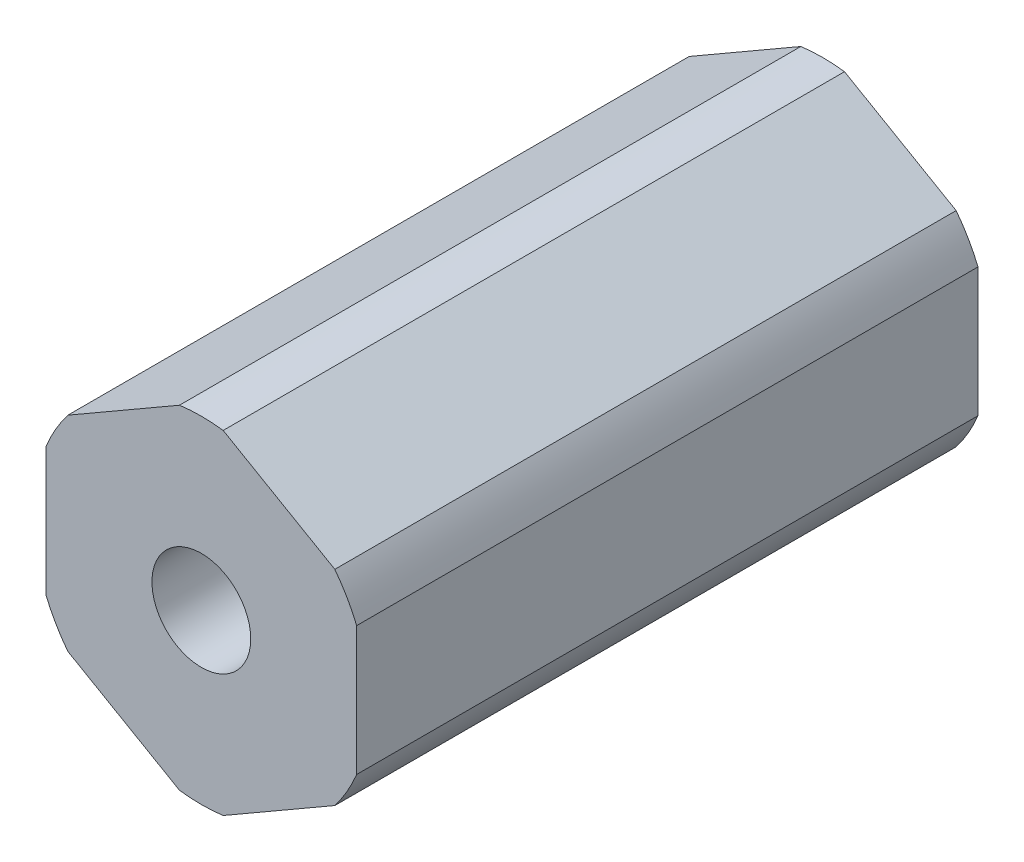
ISO-10303-21;
HEADER;
FILE_DESCRIPTION(('STEP AP214'),'2;1');
FILE_NAME('part.step','',(''),(''),'','','');
FILE_SCHEMA(('AUTOMOTIVE_DESIGN { 1 0 10303 214 1 1 1 1 }'));
ENDSEC;
DATA;
#1=APPLICATION_CONTEXT('core data for automotive mechanical design processes');
#2=APPLICATION_PROTOCOL_DEFINITION('international standard','automotive_design',2000,#1);
#3=PRODUCT_CONTEXT('',#1,'mechanical');
#4=PRODUCT('Part','Part','',(#3));
#5=PRODUCT_RELATED_PRODUCT_CATEGORY('part','',(#4));
#6=PRODUCT_DEFINITION_FORMATION('','',#4);
#7=PRODUCT_DEFINITION_CONTEXT('part definition',#1,'design');
#8=PRODUCT_DEFINITION('design','',#6,#7);
#9=PRODUCT_DEFINITION_SHAPE('','',#8);
#10=(LENGTH_UNIT() NAMED_UNIT(*) SI_UNIT(.MILLI.,.METRE.));
#11=(NAMED_UNIT(*) PLANE_ANGLE_UNIT() SI_UNIT($,.RADIAN.));
#12=(NAMED_UNIT(*) SI_UNIT($,.STERADIAN.) SOLID_ANGLE_UNIT());
#13=UNCERTAINTY_MEASURE_WITH_UNIT(LENGTH_MEASURE(1.E-05),#10,'distance_accuracy_value','');
#14=(GEOMETRIC_REPRESENTATION_CONTEXT(3) GLOBAL_UNCERTAINTY_ASSIGNED_CONTEXT((#13)) GLOBAL_UNIT_ASSIGNED_CONTEXT((#10,
#11,#12)) REPRESENTATION_CONTEXT('',''));
#15=CARTESIAN_POINT('',(0.,0.,0.));
#16=DIRECTION('',(0.,0.,1.));
#17=DIRECTION('',(1.,0.,0.));
#18=AXIS2_PLACEMENT_3D('',#15,#16,#17);
#19=CARTESIAN_POINT('',(6.34999999999999,0.,25.4));
#20=DIRECTION('',(-1.,0.,0.));
#21=DIRECTION('',(0.,-1.,0.));
#22=AXIS2_PLACEMENT_3D('',#19,#20,#21);
#23=PLANE('',#22);
#24=DIRECTION('',(0.,1.,0.));
#25=VECTOR('',#24,1.);
#26=CARTESIAN_POINT('',(6.34999999999999,0.,0.));
#27=LINE('',#26,#25);
#28=CARTESIAN_POINT('',(6.35000000000002,-2.63498093588924,0.));
#29=VERTEX_POINT('',#28);
#30=CARTESIAN_POINT('',(6.34999999999997,2.63498093588937,0.));
#31=VERTEX_POINT('',#30);
#32=EDGE_CURVE('E170',#29,#31,#27,.T.);
#33=ORIENTED_EDGE('',*,*,#32,.T.);
#34=DIRECTION('',(0.,0.,-1.));
#35=VECTOR('',#34,1.);
#36=CARTESIAN_POINT('',(6.34999999999997,2.63498093588937,25.4));
#37=LINE('',#36,#35);
#38=CARTESIAN_POINT('',(6.34999999999997,2.63498093588937,25.4));
#39=VERTEX_POINT('',#38);
#40=EDGE_CURVE('E11',#39,#31,#37,.T.);
#41=ORIENTED_EDGE('',*,*,#40,.F.);
#42=DIRECTION('',(0.,1.,0.));
#43=VECTOR('',#42,1.);
#44=CARTESIAN_POINT('',(6.34999999999999,0.,25.4));
#45=LINE('',#44,#43);
#46=CARTESIAN_POINT('',(6.35000000000002,-2.63498093588924,25.4));
#47=VERTEX_POINT('',#46);
#48=EDGE_CURVE('E229',#47,#39,#45,.T.);
#49=ORIENTED_EDGE('',*,*,#48,.F.);
#50=DIRECTION('',(0.,0.,-1.));
#51=VECTOR('',#50,1.);
#52=CARTESIAN_POINT('',(6.35000000000002,-2.63498093588924,25.4));
#53=LINE('',#52,#51);
#54=EDGE_CURVE('E163',#47,#29,#53,.T.);
#55=ORIENTED_EDGE('',*,*,#54,.T.);
#56=EDGE_LOOP('',(#33,#41,#49,#55));
#57=FACE_BOUND('',#56,.T.);
#58=ADVANCED_FACE('F45',(#57),#23,.F.);
#59=CARTESIAN_POINT('',(0.,0.,25.4));
#60=DIRECTION('',(0.,0.,-1.));
#61=DIRECTION('',(-1.,0.,0.));
#62=AXIS2_PLACEMENT_3D('',#59,#60,#61);
#63=CYLINDRICAL_SURFACE('',#62,6.874999966);
#64=CARTESIAN_POINT('',(0.,0.,0.));
#65=DIRECTION('',(0.,0.,1.));
#66=DIRECTION('',(1.,0.,0.));
#67=AXIS2_PLACEMENT_3D('',#64,#65,#66);
#68=CIRCLE('',#67,6.874999966);
#69=CARTESIAN_POINT('',(5.45696042896777,4.18177084608661,0.));
#70=VERTEX_POINT('',#69);
#71=EDGE_CURVE('E173',#31,#70,#68,.T.);
#72=ORIENTED_EDGE('',*,*,#71,.T.);
#73=DIRECTION('',(0.,0.,-1.));
#74=VECTOR('',#73,1.);
#75=CARTESIAN_POINT('',(5.45696042896777,4.18177084608661,25.4));
#76=LINE('',#75,#74);
#77=CARTESIAN_POINT('',(5.45696042896777,4.18177084608661,25.4));
#78=VERTEX_POINT('',#77);
#79=EDGE_CURVE('E54',#78,#70,#76,.T.);
#80=ORIENTED_EDGE('',*,*,#79,.F.);
#81=CARTESIAN_POINT('',(0.,0.,25.4));
#82=DIRECTION('',(0.,0.,1.));
#83=DIRECTION('',(1.,0.,0.));
#84=AXIS2_PLACEMENT_3D('',#81,#82,#83);
#85=CIRCLE('',#84,6.874999966);
#86=EDGE_CURVE('E117',#39,#78,#85,.T.);
#87=ORIENTED_EDGE('',*,*,#86,.F.);
#88=ORIENTED_EDGE('',*,*,#40,.T.);
#89=EDGE_LOOP('',(#72,#80,#87,#88));
#90=FACE_BOUND('',#89,.T.);
#91=ADVANCED_FACE('F264',(#90),#63,.T.);
#92=CARTESIAN_POINT('',(3.17499999999998,5.49926131403122,25.4));
#93=DIRECTION('',(-0.499999999999995,-0.866025403784441,0.));
#94=DIRECTION('',(0.866025403784442,-0.499999999999995,0.));
#95=AXIS2_PLACEMENT_3D('',#92,#93,#94);
#96=PLANE('',#95);
#97=DIRECTION('',(-0.866025403784442,0.499999999999995,0.));
#98=VECTOR('',#97,1.);
#99=CARTESIAN_POINT('',(3.17499999999998,5.49926131403122,0.));
#100=LINE('',#99,#98);
#101=CARTESIAN_POINT('',(0.893039571032191,6.81675178197583,0.));
#102=VERTEX_POINT('',#101);
#103=EDGE_CURVE('E175',#70,#102,#100,.T.);
#104=ORIENTED_EDGE('',*,*,#103,.T.);
#105=DIRECTION('',(0.,0.,-1.));
#106=VECTOR('',#105,1.);
#107=CARTESIAN_POINT('',(0.893039571032191,6.81675178197583,25.4));
#108=LINE('',#107,#106);
#109=CARTESIAN_POINT('',(0.893039571032191,6.81675178197583,25.4));
#110=VERTEX_POINT('',#109);
#111=EDGE_CURVE('E205',#110,#102,#108,.T.);
#112=ORIENTED_EDGE('',*,*,#111,.F.);
#113=DIRECTION('',(-0.866025403784442,0.499999999999995,0.));
#114=VECTOR('',#113,1.);
#115=CARTESIAN_POINT('',(3.17499999999998,5.49926131403122,25.4));
#116=LINE('',#115,#114);
#117=EDGE_CURVE('E213',#78,#110,#116,.T.);
#118=ORIENTED_EDGE('',*,*,#117,.F.);
#119=ORIENTED_EDGE('',*,*,#79,.T.);
#120=EDGE_LOOP('',(#104,#112,#118,#119));
#121=FACE_BOUND('',#120,.T.);
#122=ADVANCED_FACE('F211',(#121),#96,.F.);
#123=CARTESIAN_POINT('',(-0.893039571032176,6.81675178197583,0.));
#124=VERTEX_POINT('',#123);
#125=EDGE_CURVE('E176',#102,#124,#68,.T.);
#126=ORIENTED_EDGE('',*,*,#125,.T.);
#127=DIRECTION('',(0.,0.,-1.));
#128=VECTOR('',#127,1.);
#129=CARTESIAN_POINT('',(-0.893039571032176,6.81675178197583,25.4));
#130=LINE('',#129,#128);
#131=CARTESIAN_POINT('',(-0.893039571032176,6.81675178197583,25.4));
#132=VERTEX_POINT('',#131);
#133=EDGE_CURVE('E202',#132,#124,#130,.T.);
#134=ORIENTED_EDGE('',*,*,#133,.F.);
#135=EDGE_CURVE('E235',#110,#132,#85,.T.);
#136=ORIENTED_EDGE('',*,*,#135,.F.);
#137=ORIENTED_EDGE('',*,*,#111,.T.);
#138=EDGE_LOOP('',(#126,#134,#136,#137));
#139=FACE_BOUND('',#138,.T.);
#140=ADVANCED_FACE('F246',(#139),#63,.T.);
#141=CARTESIAN_POINT('',(-3.175,5.49926131403118,25.4));
#142=DIRECTION('',(0.500000000000001,-0.866025403784438,0.));
#143=DIRECTION('',(0.866025403784438,0.500000000000001,0.));
#144=AXIS2_PLACEMENT_3D('',#141,#142,#143);
#145=PLANE('',#144);
#146=DIRECTION('',(-0.866025403784438,-0.500000000000001,0.));
#147=VECTOR('',#146,1.);
#148=CARTESIAN_POINT('',(-3.175,5.49926131403118,0.));
#149=LINE('',#148,#147);
#150=CARTESIAN_POINT('',(-5.45696042896783,4.18177084608652,0.));
#151=VERTEX_POINT('',#150);
#152=EDGE_CURVE('E178',#124,#151,#149,.T.);
#153=ORIENTED_EDGE('',*,*,#152,.T.);
#154=DIRECTION('',(0.,0.,-1.));
#155=VECTOR('',#154,1.);
#156=CARTESIAN_POINT('',(-5.45696042896783,4.18177084608652,25.4));
#157=LINE('',#156,#155);
#158=CARTESIAN_POINT('',(-5.45696042896783,4.18177084608652,25.4));
#159=VERTEX_POINT('',#158);
#160=EDGE_CURVE('E199',#159,#151,#157,.T.);
#161=ORIENTED_EDGE('',*,*,#160,.F.);
#162=DIRECTION('',(-0.866025403784438,-0.500000000000001,0.));
#163=VECTOR('',#162,1.);
#164=CARTESIAN_POINT('',(-3.175,5.49926131403118,25.4));
#165=LINE('',#164,#163);
#166=EDGE_CURVE('E237',#132,#159,#165,.T.);
#167=ORIENTED_EDGE('',*,*,#166,.F.);
#168=ORIENTED_EDGE('',*,*,#133,.T.);
#169=EDGE_LOOP('',(#153,#161,#167,#168));
#170=FACE_BOUND('',#169,.T.);
#171=ADVANCED_FACE('F248',(#170),#145,.F.);
#172=CARTESIAN_POINT('',(-6.35,2.63498093588928,0.));
#173=VERTEX_POINT('',#172);
#174=EDGE_CURVE('E180',#151,#173,#68,.T.);
#175=ORIENTED_EDGE('',*,*,#174,.T.);
#176=DIRECTION('',(0.,0.,-1.));
#177=VECTOR('',#176,1.);
#178=CARTESIAN_POINT('',(-6.35,2.63498093588928,25.4));
#179=LINE('',#178,#177);
#180=CARTESIAN_POINT('',(-6.35,2.63498093588928,25.4));
#181=VERTEX_POINT('',#180);
#182=EDGE_CURVE('E196',#181,#173,#179,.T.);
#183=ORIENTED_EDGE('',*,*,#182,.F.);
#184=EDGE_CURVE('E238',#159,#181,#85,.T.);
#185=ORIENTED_EDGE('',*,*,#184,.F.);
#186=ORIENTED_EDGE('',*,*,#160,.T.);
#187=EDGE_LOOP('',(#175,#183,#185,#186));
#188=FACE_BOUND('',#187,.T.);
#189=ADVANCED_FACE('F249',(#188),#63,.T.);
#190=CARTESIAN_POINT('',(-6.34999999999999,0.,25.4));
#191=DIRECTION('',(1.,0.,0.));
#192=DIRECTION('',(0.,1.,0.));
#193=AXIS2_PLACEMENT_3D('',#190,#191,#192);
#194=PLANE('',#193);
#195=DIRECTION('',(0.,-1.,0.));
#196=VECTOR('',#195,1.);
#197=CARTESIAN_POINT('',(-6.34999999999999,0.,0.));
#198=LINE('',#197,#196);
#199=CARTESIAN_POINT('',(-6.34999999999999,-2.63498093588933,0.));
#200=VERTEX_POINT('',#199);
#201=EDGE_CURVE('E181',#173,#200,#198,.T.);
#202=ORIENTED_EDGE('',*,*,#201,.T.);
#203=DIRECTION('',(0.,0.,-1.));
#204=VECTOR('',#203,1.);
#205=CARTESIAN_POINT('',(-6.34999999999999,-2.63498093588933,25.4));
#206=LINE('',#205,#204);
#207=CARTESIAN_POINT('',(-6.34999999999999,-2.63498093588933,25.4));
#208=VERTEX_POINT('',#207);
#209=EDGE_CURVE('E193',#208,#200,#206,.T.);
#210=ORIENTED_EDGE('',*,*,#209,.F.);
#211=DIRECTION('',(0.,-1.,0.));
#212=VECTOR('',#211,1.);
#213=CARTESIAN_POINT('',(-6.34999999999999,0.,25.4));
#214=LINE('',#213,#212);
#215=EDGE_CURVE('E239',#181,#208,#214,.T.);
#216=ORIENTED_EDGE('',*,*,#215,.F.);
#217=ORIENTED_EDGE('',*,*,#182,.T.);
#218=EDGE_LOOP('',(#202,#210,#216,#217));
#219=FACE_BOUND('',#218,.T.);
#220=ADVANCED_FACE('F252',(#219),#194,.F.);
#221=CARTESIAN_POINT('',(-5.4569604289678,-4.18177084608656,0.));
#222=VERTEX_POINT('',#221);
#223=EDGE_CURVE('E183',#200,#222,#68,.T.);
#224=ORIENTED_EDGE('',*,*,#223,.T.);
#225=DIRECTION('',(0.,0.,-1.));
#226=VECTOR('',#225,1.);
#227=CARTESIAN_POINT('',(-5.4569604289678,-4.18177084608656,25.4));
#228=LINE('',#227,#226);
#229=CARTESIAN_POINT('',(-5.4569604289678,-4.18177084608656,25.4));
#230=VERTEX_POINT('',#229);
#231=EDGE_CURVE('E190',#230,#222,#228,.T.);
#232=ORIENTED_EDGE('',*,*,#231,.F.);
#233=EDGE_CURVE('E153',#208,#230,#85,.T.);
#234=ORIENTED_EDGE('',*,*,#233,.F.);
#235=ORIENTED_EDGE('',*,*,#209,.T.);
#236=EDGE_LOOP('',(#224,#232,#234,#235));
#237=FACE_BOUND('',#236,.T.);
#238=ADVANCED_FACE('F254',(#237),#63,.T.);
#239=CARTESIAN_POINT('',(-3.17499999999996,-5.4992613140312,25.4));
#240=DIRECTION('',(0.499999999999995,0.866025403784442,0.));
#241=DIRECTION('',(-0.866025403784442,0.499999999999995,0.));
#242=AXIS2_PLACEMENT_3D('',#239,#240,#241);
#243=PLANE('',#242);
#244=DIRECTION('',(0.866025403784442,-0.499999999999995,0.));
#245=VECTOR('',#244,1.);
#246=CARTESIAN_POINT('',(-3.17499999999996,-5.4992613140312,0.));
#247=LINE('',#246,#245);
#248=CARTESIAN_POINT('',(-0.893039571032124,-6.81675178197584,0.));
#249=VERTEX_POINT('',#248);
#250=EDGE_CURVE('E184',#222,#249,#247,.T.);
#251=ORIENTED_EDGE('',*,*,#250,.T.);
#252=DIRECTION('',(0.,0.,-1.));
#253=VECTOR('',#252,1.);
#254=CARTESIAN_POINT('',(-0.893039571032124,-6.81675178197584,25.4));
#255=LINE('',#254,#253);
#256=CARTESIAN_POINT('',(-0.893039571032124,-6.81675178197584,25.4));
#257=VERTEX_POINT('',#256);
#258=EDGE_CURVE('E158',#257,#249,#255,.T.);
#259=ORIENTED_EDGE('',*,*,#258,.F.);
#260=DIRECTION('',(0.866025403784442,-0.499999999999995,0.));
#261=VECTOR('',#260,1.);
#262=CARTESIAN_POINT('',(-3.17499999999996,-5.4992613140312,25.4));
#263=LINE('',#262,#261);
#264=EDGE_CURVE('E148',#230,#257,#263,.T.);
#265=ORIENTED_EDGE('',*,*,#264,.F.);
#266=ORIENTED_EDGE('',*,*,#231,.T.);
#267=EDGE_LOOP('',(#251,#259,#265,#266));
#268=FACE_BOUND('',#267,.T.);
#269=ADVANCED_FACE('F257',(#268),#243,.F.);
#270=CARTESIAN_POINT('',(0.893039571032224,-6.81675178197583,0.));
#271=VERTEX_POINT('',#270);
#272=EDGE_CURVE('E157',#249,#271,#68,.T.);
#273=ORIENTED_EDGE('',*,*,#272,.T.);
#274=DIRECTION('',(0.,0.,-1.));
#275=VECTOR('',#274,1.);
#276=CARTESIAN_POINT('',(0.893039571032224,-6.81675178197583,25.4));
#277=LINE('',#276,#275);
#278=CARTESIAN_POINT('',(0.893039571032224,-6.81675178197583,25.4));
#279=VERTEX_POINT('',#278);
#280=EDGE_CURVE('E154',#279,#271,#277,.T.);
#281=ORIENTED_EDGE('',*,*,#280,.F.);
#282=EDGE_CURVE('E142',#257,#279,#85,.T.);
#283=ORIENTED_EDGE('',*,*,#282,.F.);
#284=ORIENTED_EDGE('',*,*,#258,.T.);
#285=EDGE_LOOP('',(#273,#281,#283,#284));
#286=FACE_BOUND('',#285,.T.);
#287=ADVANCED_FACE('F155',(#286),#63,.T.);
#288=CARTESIAN_POINT('',(3.17500000000004,-5.49926131403116,25.4));
#289=DIRECTION('',(-0.500000000000007,0.866025403784435,0.));
#290=DIRECTION('',(-0.866025403784435,-0.500000000000007,0.));
#291=AXIS2_PLACEMENT_3D('',#288,#289,#290);
#292=PLANE('',#291);
#293=DIRECTION('',(0.866025403784435,0.500000000000007,0.));
#294=VECTOR('',#293,1.);
#295=CARTESIAN_POINT('',(3.17500000000004,-5.49926131403116,0.));
#296=LINE('',#295,#294);
#297=CARTESIAN_POINT('',(5.45696042896786,-4.18177084608649,0.));
#298=VERTEX_POINT('',#297);
#299=EDGE_CURVE('E103',#271,#298,#296,.T.);
#300=ORIENTED_EDGE('',*,*,#299,.T.);
#301=DIRECTION('',(0.,0.,-1.));
#302=VECTOR('',#301,1.);
#303=CARTESIAN_POINT('',(5.45696042896786,-4.18177084608649,25.4));
#304=LINE('',#303,#302);
#305=CARTESIAN_POINT('',(5.45696042896786,-4.18177084608649,25.4));
#306=VERTEX_POINT('',#305);
#307=EDGE_CURVE('E159',#306,#298,#304,.T.);
#308=ORIENTED_EDGE('',*,*,#307,.F.);
#309=DIRECTION('',(0.866025403784435,0.500000000000007,0.));
#310=VECTOR('',#309,1.);
#311=CARTESIAN_POINT('',(3.17500000000004,-5.49926131403116,25.4));
#312=LINE('',#311,#310);
#313=EDGE_CURVE('E146',#279,#306,#312,.T.);
#314=ORIENTED_EDGE('',*,*,#313,.F.);
#315=ORIENTED_EDGE('',*,*,#280,.T.);
#316=EDGE_LOOP('',(#300,#308,#314,#315));
#317=FACE_BOUND('',#316,.T.);
#318=ADVANCED_FACE('F161',(#317),#292,.F.);
#319=CARTESIAN_POINT('',(0.,0.,25.4));
#320=DIRECTION('',(0.,0.,-1.));
#321=DIRECTION('',(-1.,0.,0.));
#322=AXIS2_PLACEMENT_3D('',#319,#320,#321);
#323=CYLINDRICAL_SURFACE('',#322,2.0193);
#324=CARTESIAN_POINT('',(0.,0.,25.4));
#325=DIRECTION('',(0.,0.,1.));
#326=DIRECTION('',(1.,0.,0.));
#327=AXIS2_PLACEMENT_3D('',#324,#325,#326);
#328=CIRCLE('',#327,2.0193);
#329=CARTESIAN_POINT('',(2.0193,0.,25.4));
#330=VERTEX_POINT('',#329);
#331=EDGE_CURVE('E227',#330,#330,#328,.T.);
#332=ORIENTED_EDGE('',*,*,#331,.T.);
#333=EDGE_LOOP('',(#332));
#334=FACE_BOUND('',#333,.T.);
#335=CARTESIAN_POINT('',(0.,0.,0.));
#336=DIRECTION('',(0.,0.,1.));
#337=DIRECTION('',(1.,0.,0.));
#338=AXIS2_PLACEMENT_3D('',#335,#336,#337);
#339=CIRCLE('',#338,2.0193);
#340=CARTESIAN_POINT('',(2.0193,0.,0.));
#341=VERTEX_POINT('',#340);
#342=EDGE_CURVE('E167',#341,#341,#339,.T.);
#343=ORIENTED_EDGE('',*,*,#342,.F.);
#344=EDGE_LOOP('',(#343));
#345=FACE_BOUND('',#344,.T.);
#346=ADVANCED_FACE('F47',(#334,#345),#323,.F.);
#347=EDGE_CURVE('E109',#298,#29,#68,.T.);
#348=ORIENTED_EDGE('',*,*,#347,.T.);
#349=ORIENTED_EDGE('',*,*,#54,.F.);
#350=EDGE_CURVE('E62',#306,#47,#85,.T.);
#351=ORIENTED_EDGE('',*,*,#350,.F.);
#352=ORIENTED_EDGE('',*,*,#307,.T.);
#353=EDGE_LOOP('',(#348,#349,#351,#352));
#354=FACE_BOUND('',#353,.T.);
#355=ADVANCED_FACE('F261',(#354),#63,.T.);
#356=CARTESIAN_POINT('',(0.,0.,25.4));
#357=DIRECTION('',(0.,0.,1.));
#358=DIRECTION('',(1.,0.,0.));
#359=AXIS2_PLACEMENT_3D('',#356,#357,#358);
#360=PLANE('',#359);
#361=ORIENTED_EDGE('',*,*,#331,.F.);
#362=EDGE_LOOP('',(#361));
#363=FACE_BOUND('',#362,.T.);
#364=ORIENTED_EDGE('',*,*,#48,.T.);
#365=ORIENTED_EDGE('',*,*,#86,.T.);
#366=ORIENTED_EDGE('',*,*,#117,.T.);
#367=ORIENTED_EDGE('',*,*,#135,.T.);
#368=ORIENTED_EDGE('',*,*,#166,.T.);
#369=ORIENTED_EDGE('',*,*,#184,.T.);
#370=ORIENTED_EDGE('',*,*,#215,.T.);
#371=ORIENTED_EDGE('',*,*,#233,.T.);
#372=ORIENTED_EDGE('',*,*,#264,.T.);
#373=ORIENTED_EDGE('',*,*,#282,.T.);
#374=ORIENTED_EDGE('',*,*,#313,.T.);
#375=ORIENTED_EDGE('',*,*,#350,.T.);
#376=EDGE_LOOP('',(#364,#365,#366,#367,#368,#369,#370,#371,#372,#373,#374,#375));
#377=FACE_BOUND('',#376,.T.);
#378=ADVANCED_FACE('F144',(#363,#377),#360,.T.);
#379=CARTESIAN_POINT('',(0.,0.,0.));
#380=DIRECTION('',(0.,0.,1.));
#381=DIRECTION('',(1.,0.,0.));
#382=AXIS2_PLACEMENT_3D('',#379,#380,#381);
#383=PLANE('',#382);
#384=ORIENTED_EDGE('',*,*,#342,.T.);
#385=EDGE_LOOP('',(#384));
#386=FACE_BOUND('',#385,.T.);
#387=ORIENTED_EDGE('',*,*,#32,.F.);
#388=ORIENTED_EDGE('',*,*,#347,.F.);
#389=ORIENTED_EDGE('',*,*,#299,.F.);
#390=ORIENTED_EDGE('',*,*,#272,.F.);
#391=ORIENTED_EDGE('',*,*,#250,.F.);
#392=ORIENTED_EDGE('',*,*,#223,.F.);
#393=ORIENTED_EDGE('',*,*,#201,.F.);
#394=ORIENTED_EDGE('',*,*,#174,.F.);
#395=ORIENTED_EDGE('',*,*,#152,.F.);
#396=ORIENTED_EDGE('',*,*,#125,.F.);
#397=ORIENTED_EDGE('',*,*,#103,.F.);
#398=ORIENTED_EDGE('',*,*,#71,.F.);
#399=EDGE_LOOP('',(#387,#388,#389,#390,#391,#392,#393,#394,#395,#396,#397,#398));
#400=FACE_BOUND('',#399,.T.);
#401=ADVANCED_FACE('F217',(#386,#400),#383,.F.);
#402=CLOSED_SHELL('',(#58,#91,#122,#140,#171,#189,#220,#238,#269,#287,#318,#346,#355,#378,#401));
#403=MANIFOLD_SOLID_BREP('B2',#402);
#404=ADVANCED_BREP_SHAPE_REPRESENTATION('',(#18,#403),#14);
#405=SHAPE_DEFINITION_REPRESENTATION(#9,#404);
ENDSEC;
END-ISO-10303-21;
